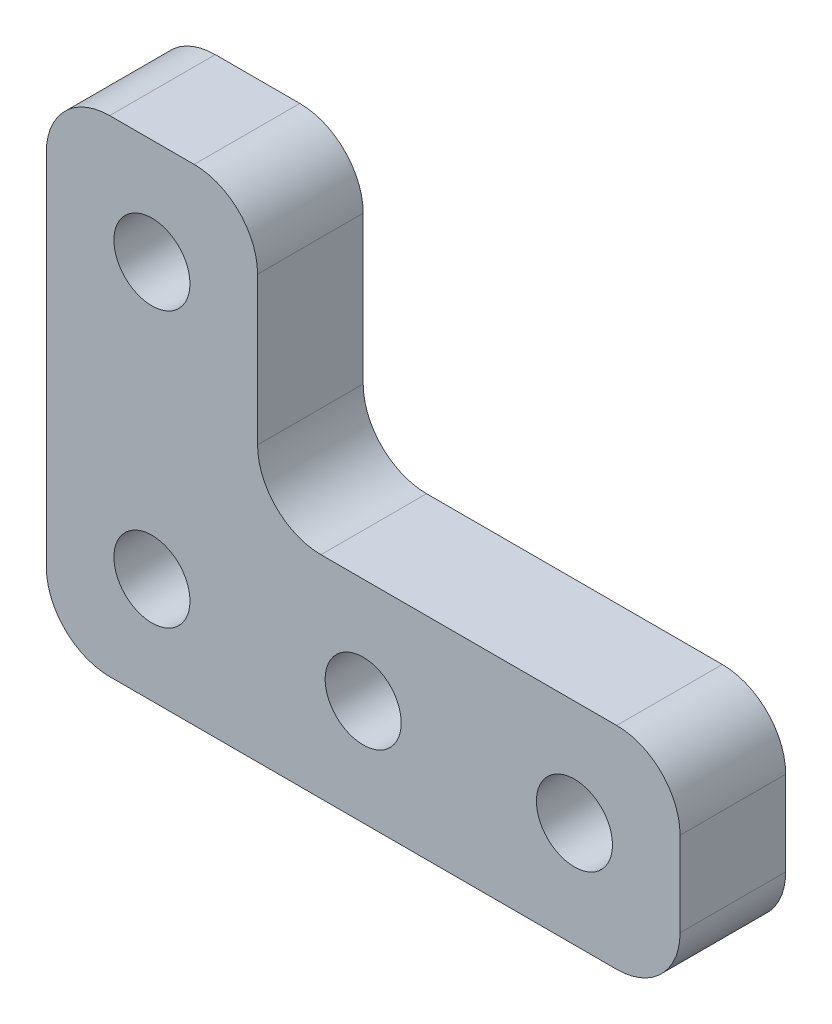
ISO-10303-21;
HEADER;
FILE_DESCRIPTION(('STEP AP214'),'2;1');
FILE_NAME('part.step','',(''),(''),'','','');
FILE_SCHEMA(('AUTOMOTIVE_DESIGN { 1 0 10303 214 1 1 1 1 }'));
ENDSEC;
DATA;
#1=APPLICATION_CONTEXT('core data for automotive mechanical design processes');
#2=APPLICATION_PROTOCOL_DEFINITION('international standard','automotive_design',2000,#1);
#3=PRODUCT_CONTEXT('',#1,'mechanical');
#4=PRODUCT('Part','Part','',(#3));
#5=PRODUCT_RELATED_PRODUCT_CATEGORY('part','',(#4));
#6=PRODUCT_DEFINITION_FORMATION('','',#4);
#7=PRODUCT_DEFINITION_CONTEXT('part definition',#1,'design');
#8=PRODUCT_DEFINITION('design','',#6,#7);
#9=PRODUCT_DEFINITION_SHAPE('','',#8);
#10=(LENGTH_UNIT() NAMED_UNIT(*) SI_UNIT(.MILLI.,.METRE.));
#11=(NAMED_UNIT(*) PLANE_ANGLE_UNIT() SI_UNIT($,.RADIAN.));
#12=(NAMED_UNIT(*) SI_UNIT($,.STERADIAN.) SOLID_ANGLE_UNIT());
#13=UNCERTAINTY_MEASURE_WITH_UNIT(LENGTH_MEASURE(1.E-05),#10,'distance_accuracy_value','');
#14=(GEOMETRIC_REPRESENTATION_CONTEXT(3) GLOBAL_UNCERTAINTY_ASSIGNED_CONTEXT((#13)) GLOBAL_UNIT_ASSIGNED_CONTEXT((#10,
#11,#12)) REPRESENTATION_CONTEXT('',''));
#15=CARTESIAN_POINT('',(0.,0.,0.));
#16=DIRECTION('',(0.,0.,1.));
#17=DIRECTION('',(1.,0.,0.));
#18=AXIS2_PLACEMENT_3D('',#15,#16,#17);
#19=CARTESIAN_POINT('',(0.,0.,6.35));
#20=DIRECTION('',(0.,0.,-1.));
#21=DIRECTION('',(-1.,0.,0.));
#22=AXIS2_PLACEMENT_3D('',#19,#20,#21);
#23=PLANE('',#22);
#24=DIRECTION('',(0.,1.,0.));
#25=VECTOR('',#24,1.);
#26=CARTESIAN_POINT('',(31.75,6.35,6.35));
#27=LINE('',#26,#25);
#28=CARTESIAN_POINT('',(31.75,-2.54,6.35));
#29=VERTEX_POINT('',#28);
#30=CARTESIAN_POINT('',(31.75,2.54,6.35));
#31=VERTEX_POINT('',#30);
#32=EDGE_CURVE('E265',#29,#31,#27,.T.);
#33=ORIENTED_EDGE('',*,*,#32,.T.);
#34=CARTESIAN_POINT('',(27.94,2.54,6.35));
#35=DIRECTION('',(0.,0.,-1.));
#36=DIRECTION('',(-1.,0.,0.));
#37=AXIS2_PLACEMENT_3D('',#34,#35,#36);
#38=CIRCLE('',#37,3.81);
#39=CARTESIAN_POINT('',(27.94,6.35,6.35));
#40=VERTEX_POINT('',#39);
#41=EDGE_CURVE('E228',#31,#40,#38,.F.);
#42=ORIENTED_EDGE('',*,*,#41,.T.);
#43=DIRECTION('',(-1.,0.,0.));
#44=VECTOR('',#43,1.);
#45=CARTESIAN_POINT('',(6.35,6.35,6.35));
#46=LINE('',#45,#44);
#47=CARTESIAN_POINT('',(10.16,6.35,6.35));
#48=VERTEX_POINT('',#47);
#49=EDGE_CURVE('E172',#40,#48,#46,.T.);
#50=ORIENTED_EDGE('',*,*,#49,.T.);
#51=CARTESIAN_POINT('',(10.16,10.16,6.35));
#52=DIRECTION('',(0.,0.,-1.));
#53=DIRECTION('',(-1.,0.,0.));
#54=AXIS2_PLACEMENT_3D('',#51,#52,#53);
#55=CIRCLE('',#54,3.81);
#56=CARTESIAN_POINT('',(6.35,10.16,6.35));
#57=VERTEX_POINT('',#56);
#58=EDGE_CURVE('E11',#48,#57,#55,.T.);
#59=ORIENTED_EDGE('',*,*,#58,.T.);
#60=DIRECTION('',(0.,1.,0.));
#61=VECTOR('',#60,1.);
#62=CARTESIAN_POINT('',(6.35,22.86,6.35));
#63=LINE('',#62,#61);
#64=CARTESIAN_POINT('',(6.35,19.05,6.35));
#65=VERTEX_POINT('',#64);
#66=EDGE_CURVE('E260',#57,#65,#63,.T.);
#67=ORIENTED_EDGE('',*,*,#66,.T.);
#68=CARTESIAN_POINT('',(2.54,19.05,6.35));
#69=DIRECTION('',(0.,0.,-1.));
#70=DIRECTION('',(-1.,0.,0.));
#71=AXIS2_PLACEMENT_3D('',#68,#69,#70);
#72=CIRCLE('',#71,3.81);
#73=CARTESIAN_POINT('',(2.54,22.86,6.35));
#74=VERTEX_POINT('',#73);
#75=EDGE_CURVE('E219',#65,#74,#72,.F.);
#76=ORIENTED_EDGE('',*,*,#75,.T.);
#77=DIRECTION('',(-1.,0.,0.));
#78=VECTOR('',#77,1.);
#79=CARTESIAN_POINT('',(-6.35,22.86,6.35));
#80=LINE('',#79,#78);
#81=CARTESIAN_POINT('',(-2.54,22.86,6.35));
#82=VERTEX_POINT('',#81);
#83=EDGE_CURVE('E262',#74,#82,#80,.T.);
#84=ORIENTED_EDGE('',*,*,#83,.T.);
#85=CARTESIAN_POINT('',(-2.54,19.05,6.35));
#86=DIRECTION('',(0.,0.,-1.));
#87=DIRECTION('',(-1.,0.,0.));
#88=AXIS2_PLACEMENT_3D('',#85,#86,#87);
#89=CIRCLE('',#88,3.81);
#90=CARTESIAN_POINT('',(-6.35,19.05,6.35));
#91=VERTEX_POINT('',#90);
#92=EDGE_CURVE('E66',#82,#91,#89,.F.);
#93=ORIENTED_EDGE('',*,*,#92,.T.);
#94=DIRECTION('',(0.,-1.,0.));
#95=VECTOR('',#94,1.);
#96=CARTESIAN_POINT('',(-6.35,-6.35,6.35));
#97=LINE('',#96,#95);
#98=CARTESIAN_POINT('',(-6.35,-2.54,6.35));
#99=VERTEX_POINT('',#98);
#100=EDGE_CURVE('E203',#91,#99,#97,.T.);
#101=ORIENTED_EDGE('',*,*,#100,.T.);
#102=CARTESIAN_POINT('',(-2.54,-2.54,6.35));
#103=DIRECTION('',(0.,0.,-1.));
#104=DIRECTION('',(-1.,0.,0.));
#105=AXIS2_PLACEMENT_3D('',#102,#103,#104);
#106=CIRCLE('',#105,3.81);
#107=CARTESIAN_POINT('',(-2.53999999999999,-6.35,6.35));
#108=VERTEX_POINT('',#107);
#109=EDGE_CURVE('E223',#99,#108,#106,.F.);
#110=ORIENTED_EDGE('',*,*,#109,.T.);
#111=DIRECTION('',(1.,0.,0.));
#112=VECTOR('',#111,1.);
#113=CARTESIAN_POINT('',(31.75,-6.35,6.35));
#114=LINE('',#113,#112);
#115=CARTESIAN_POINT('',(27.94,-6.35,6.35));
#116=VERTEX_POINT('',#115);
#117=EDGE_CURVE('E201',#108,#116,#114,.T.);
#118=ORIENTED_EDGE('',*,*,#117,.T.);
#119=CARTESIAN_POINT('',(27.94,-2.54,6.35));
#120=DIRECTION('',(0.,0.,-1.));
#121=DIRECTION('',(-1.,0.,0.));
#122=AXIS2_PLACEMENT_3D('',#119,#120,#121);
#123=CIRCLE('',#122,3.81);
#124=EDGE_CURVE('E225',#116,#29,#123,.F.);
#125=ORIENTED_EDGE('',*,*,#124,.T.);
#126=EDGE_LOOP('',(#33,#42,#50,#59,#67,#76,#84,#93,#101,#110,#118,#125));
#127=FACE_BOUND('',#126,.T.);
#128=CARTESIAN_POINT('',(0.,0.,6.35));
#129=DIRECTION('',(0.,0.,1.));
#130=DIRECTION('',(1.,0.,0.));
#131=AXIS2_PLACEMENT_3D('',#128,#129,#130);
#132=CIRCLE('',#131,2.286);
#133=CARTESIAN_POINT('',(2.286,0.,6.35));
#134=VERTEX_POINT('',#133);
#135=EDGE_CURVE('E259',#134,#134,#132,.T.);
#136=ORIENTED_EDGE('',*,*,#135,.F.);
#137=EDGE_LOOP('',(#136));
#138=FACE_BOUND('',#137,.T.);
#139=CARTESIAN_POINT('',(12.7,0.,6.35));
#140=DIRECTION('',(0.,0.,1.));
#141=DIRECTION('',(1.,0.,0.));
#142=AXIS2_PLACEMENT_3D('',#139,#140,#141);
#143=CIRCLE('',#142,2.286);
#144=CARTESIAN_POINT('',(14.986,0.,6.35));
#145=VERTEX_POINT('',#144);
#146=EDGE_CURVE('E274',#145,#145,#143,.T.);
#147=ORIENTED_EDGE('',*,*,#146,.F.);
#148=EDGE_LOOP('',(#147));
#149=FACE_BOUND('',#148,.T.);
#150=CARTESIAN_POINT('',(25.4,0.,6.35));
#151=DIRECTION('',(0.,0.,1.));
#152=DIRECTION('',(1.,0.,0.));
#153=AXIS2_PLACEMENT_3D('',#150,#151,#152);
#154=CIRCLE('',#153,2.286);
#155=CARTESIAN_POINT('',(27.686,0.,6.35));
#156=VERTEX_POINT('',#155);
#157=EDGE_CURVE('E299',#156,#156,#154,.T.);
#158=ORIENTED_EDGE('',*,*,#157,.F.);
#159=EDGE_LOOP('',(#158));
#160=FACE_BOUND('',#159,.T.);
#161=CARTESIAN_POINT('',(0.,16.51,6.35));
#162=DIRECTION('',(0.,0.,1.));
#163=DIRECTION('',(1.,0.,0.));
#164=AXIS2_PLACEMENT_3D('',#161,#162,#163);
#165=CIRCLE('',#164,2.286);
#166=CARTESIAN_POINT('',(2.286,16.51,6.35));
#167=VERTEX_POINT('',#166);
#168=EDGE_CURVE('E279',#167,#167,#165,.T.);
#169=ORIENTED_EDGE('',*,*,#168,.F.);
#170=EDGE_LOOP('',(#169));
#171=FACE_BOUND('',#170,.T.);
#172=ADVANCED_FACE('F43',(#127,#138,#149,#160,#171),#23,.F.);
#173=CARTESIAN_POINT('',(0.,0.,0.));
#174=DIRECTION('',(0.,0.,-1.));
#175=DIRECTION('',(-1.,0.,0.));
#176=AXIS2_PLACEMENT_3D('',#173,#174,#175);
#177=PLANE('',#176);
#178=CARTESIAN_POINT('',(25.4,0.,0.));
#179=DIRECTION('',(0.,0.,1.));
#180=DIRECTION('',(1.,0.,0.));
#181=AXIS2_PLACEMENT_3D('',#178,#179,#180);
#182=CIRCLE('',#181,2.286);
#183=CARTESIAN_POINT('',(27.686,0.,0.));
#184=VERTEX_POINT('',#183);
#185=EDGE_CURVE('E281',#184,#184,#182,.T.);
#186=ORIENTED_EDGE('',*,*,#185,.T.);
#187=EDGE_LOOP('',(#186));
#188=FACE_BOUND('',#187,.T.);
#189=CARTESIAN_POINT('',(0.,0.,0.));
#190=DIRECTION('',(0.,0.,1.));
#191=DIRECTION('',(1.,0.,0.));
#192=AXIS2_PLACEMENT_3D('',#189,#190,#191);
#193=CIRCLE('',#192,2.286);
#194=CARTESIAN_POINT('',(2.286,0.,0.));
#195=VERTEX_POINT('',#194);
#196=EDGE_CURVE('E270',#195,#195,#193,.T.);
#197=ORIENTED_EDGE('',*,*,#196,.T.);
#198=EDGE_LOOP('',(#197));
#199=FACE_BOUND('',#198,.T.);
#200=DIRECTION('',(-1.,0.,0.));
#201=VECTOR('',#200,1.);
#202=CARTESIAN_POINT('',(6.35,6.35,0.));
#203=LINE('',#202,#201);
#204=CARTESIAN_POINT('',(27.94,6.35,0.));
#205=VERTEX_POINT('',#204);
#206=CARTESIAN_POINT('',(10.16,6.35,0.));
#207=VERTEX_POINT('',#206);
#208=EDGE_CURVE('E169',#205,#207,#203,.T.);
#209=ORIENTED_EDGE('',*,*,#208,.F.);
#210=CARTESIAN_POINT('',(27.94,2.54,0.));
#211=DIRECTION('',(0.,0.,-1.));
#212=DIRECTION('',(-1.,0.,0.));
#213=AXIS2_PLACEMENT_3D('',#210,#211,#212);
#214=CIRCLE('',#213,3.81);
#215=CARTESIAN_POINT('',(31.75,2.54,0.));
#216=VERTEX_POINT('',#215);
#217=EDGE_CURVE('E151',#205,#216,#214,.T.);
#218=ORIENTED_EDGE('',*,*,#217,.T.);
#219=DIRECTION('',(0.,1.,0.));
#220=VECTOR('',#219,1.);
#221=CARTESIAN_POINT('',(31.75,6.35,0.));
#222=LINE('',#221,#220);
#223=CARTESIAN_POINT('',(31.75,-2.54,0.));
#224=VERTEX_POINT('',#223);
#225=EDGE_CURVE('E182',#224,#216,#222,.T.);
#226=ORIENTED_EDGE('',*,*,#225,.F.);
#227=CARTESIAN_POINT('',(27.94,-2.54,0.));
#228=DIRECTION('',(0.,0.,-1.));
#229=DIRECTION('',(-1.,0.,0.));
#230=AXIS2_PLACEMENT_3D('',#227,#228,#229);
#231=CIRCLE('',#230,3.81);
#232=CARTESIAN_POINT('',(27.94,-6.35,0.));
#233=VERTEX_POINT('',#232);
#234=EDGE_CURVE('E163',#224,#233,#231,.T.);
#235=ORIENTED_EDGE('',*,*,#234,.T.);
#236=DIRECTION('',(1.,0.,0.));
#237=VECTOR('',#236,1.);
#238=CARTESIAN_POINT('',(31.75,-6.35,0.));
#239=LINE('',#238,#237);
#240=CARTESIAN_POINT('',(-2.53999999999999,-6.35,0.));
#241=VERTEX_POINT('',#240);
#242=EDGE_CURVE('E191',#241,#233,#239,.T.);
#243=ORIENTED_EDGE('',*,*,#242,.F.);
#244=CARTESIAN_POINT('',(-2.54,-2.54,0.));
#245=DIRECTION('',(0.,0.,-1.));
#246=DIRECTION('',(-1.,0.,0.));
#247=AXIS2_PLACEMENT_3D('',#244,#245,#246);
#248=CIRCLE('',#247,3.81);
#249=CARTESIAN_POINT('',(-6.35,-2.54,0.));
#250=VERTEX_POINT('',#249);
#251=EDGE_CURVE('E209',#241,#250,#248,.T.);
#252=ORIENTED_EDGE('',*,*,#251,.T.);
#253=DIRECTION('',(0.,-1.,0.));
#254=VECTOR('',#253,1.);
#255=CARTESIAN_POINT('',(-6.35,-6.35,0.));
#256=LINE('',#255,#254);
#257=CARTESIAN_POINT('',(-6.35,19.05,0.));
#258=VERTEX_POINT('',#257);
#259=EDGE_CURVE('E198',#258,#250,#256,.T.);
#260=ORIENTED_EDGE('',*,*,#259,.F.);
#261=CARTESIAN_POINT('',(-2.54,19.05,0.));
#262=DIRECTION('',(0.,0.,-1.));
#263=DIRECTION('',(-1.,0.,0.));
#264=AXIS2_PLACEMENT_3D('',#261,#262,#263);
#265=CIRCLE('',#264,3.81);
#266=CARTESIAN_POINT('',(-2.54,22.86,0.));
#267=VERTEX_POINT('',#266);
#268=EDGE_CURVE('E207',#258,#267,#265,.T.);
#269=ORIENTED_EDGE('',*,*,#268,.T.);
#270=DIRECTION('',(-1.,0.,0.));
#271=VECTOR('',#270,1.);
#272=CARTESIAN_POINT('',(-6.35,22.86,0.));
#273=LINE('',#272,#271);
#274=CARTESIAN_POINT('',(2.54,22.86,0.));
#275=VERTEX_POINT('',#274);
#276=EDGE_CURVE('E188',#275,#267,#273,.T.);
#277=ORIENTED_EDGE('',*,*,#276,.F.);
#278=CARTESIAN_POINT('',(2.54,19.05,0.));
#279=DIRECTION('',(0.,0.,-1.));
#280=DIRECTION('',(-1.,0.,0.));
#281=AXIS2_PLACEMENT_3D('',#278,#279,#280);
#282=CIRCLE('',#281,3.81);
#283=CARTESIAN_POINT('',(6.35,19.05,0.));
#284=VERTEX_POINT('',#283);
#285=EDGE_CURVE('E174',#275,#284,#282,.T.);
#286=ORIENTED_EDGE('',*,*,#285,.T.);
#287=DIRECTION('',(0.,1.,0.));
#288=VECTOR('',#287,1.);
#289=CARTESIAN_POINT('',(6.35,22.86,0.));
#290=LINE('',#289,#288);
#291=CARTESIAN_POINT('',(6.35,10.16,0.));
#292=VERTEX_POINT('',#291);
#293=EDGE_CURVE('E181',#292,#284,#290,.T.);
#294=ORIENTED_EDGE('',*,*,#293,.F.);
#295=CARTESIAN_POINT('',(10.16,10.16,0.));
#296=DIRECTION('',(0.,0.,-1.));
#297=DIRECTION('',(-1.,0.,0.));
#298=AXIS2_PLACEMENT_3D('',#295,#296,#297);
#299=CIRCLE('',#298,3.81);
#300=EDGE_CURVE('E52',#292,#207,#299,.F.);
#301=ORIENTED_EDGE('',*,*,#300,.T.);
#302=EDGE_LOOP('',(#209,#218,#226,#235,#243,#252,#260,#269,#277,#286,#294,#301));
#303=FACE_BOUND('',#302,.T.);
#304=CARTESIAN_POINT('',(12.7,0.,0.));
#305=DIRECTION('',(0.,0.,1.));
#306=DIRECTION('',(1.,0.,0.));
#307=AXIS2_PLACEMENT_3D('',#304,#305,#306);
#308=CIRCLE('',#307,2.286);
#309=CARTESIAN_POINT('',(14.986,0.,0.));
#310=VERTEX_POINT('',#309);
#311=EDGE_CURVE('E295',#310,#310,#308,.T.);
#312=ORIENTED_EDGE('',*,*,#311,.T.);
#313=EDGE_LOOP('',(#312));
#314=FACE_BOUND('',#313,.T.);
#315=CARTESIAN_POINT('',(0.,16.51,0.));
#316=DIRECTION('',(0.,0.,1.));
#317=DIRECTION('',(1.,0.,0.));
#318=AXIS2_PLACEMENT_3D('',#315,#316,#317);
#319=CIRCLE('',#318,2.286);
#320=CARTESIAN_POINT('',(2.286,16.51,0.));
#321=VERTEX_POINT('',#320);
#322=EDGE_CURVE('E282',#321,#321,#319,.T.);
#323=ORIENTED_EDGE('',*,*,#322,.T.);
#324=EDGE_LOOP('',(#323));
#325=FACE_BOUND('',#324,.T.);
#326=ADVANCED_FACE('F177',(#188,#199,#303,#314,#325),#177,.T.);
#327=CARTESIAN_POINT('',(31.75,-6.35,6.35));
#328=DIRECTION('',(0.,1.,0.));
#329=DIRECTION('',(-1.,0.,0.));
#330=AXIS2_PLACEMENT_3D('',#327,#328,#329);
#331=PLANE('',#330);
#332=ORIENTED_EDGE('',*,*,#242,.T.);
#333=DIRECTION('',(0.,0.,-1.));
#334=VECTOR('',#333,1.);
#335=CARTESIAN_POINT('',(27.94,-6.35,6.35));
#336=LINE('',#335,#334);
#337=EDGE_CURVE('E234',#233,#116,#336,.F.);
#338=ORIENTED_EDGE('',*,*,#337,.T.);
#339=ORIENTED_EDGE('',*,*,#117,.F.);
#340=DIRECTION('',(0.,0.,-1.));
#341=VECTOR('',#340,1.);
#342=CARTESIAN_POINT('',(-2.54,-6.35,6.35));
#343=LINE('',#342,#341);
#344=EDGE_CURVE('E231',#108,#241,#343,.T.);
#345=ORIENTED_EDGE('',*,*,#344,.T.);
#346=EDGE_LOOP('',(#332,#338,#339,#345));
#347=FACE_BOUND('',#346,.T.);
#348=ADVANCED_FACE('F323',(#347),#331,.F.);
#349=CARTESIAN_POINT('',(31.75,6.35,6.35));
#350=DIRECTION('',(-1.,0.,0.));
#351=DIRECTION('',(0.,0.,1.));
#352=AXIS2_PLACEMENT_3D('',#349,#350,#351);
#353=PLANE('',#352);
#354=ORIENTED_EDGE('',*,*,#225,.T.);
#355=DIRECTION('',(0.,0.,-1.));
#356=VECTOR('',#355,1.);
#357=CARTESIAN_POINT('',(31.75,2.54,6.35));
#358=LINE('',#357,#356);
#359=EDGE_CURVE('E156',#216,#31,#358,.F.);
#360=ORIENTED_EDGE('',*,*,#359,.T.);
#361=ORIENTED_EDGE('',*,*,#32,.F.);
#362=DIRECTION('',(0.,0.,-1.));
#363=VECTOR('',#362,1.);
#364=CARTESIAN_POINT('',(31.75,-2.54,6.35));
#365=LINE('',#364,#363);
#366=EDGE_CURVE('E162',#29,#224,#365,.T.);
#367=ORIENTED_EDGE('',*,*,#366,.T.);
#368=EDGE_LOOP('',(#354,#360,#361,#367));
#369=FACE_BOUND('',#368,.T.);
#370=ADVANCED_FACE('F329',(#369),#353,.F.);
#371=CARTESIAN_POINT('',(6.35,6.35,6.35));
#372=DIRECTION('',(0.,-1.,0.));
#373=DIRECTION('',(1.,0.,0.));
#374=AXIS2_PLACEMENT_3D('',#371,#372,#373);
#375=PLANE('',#374);
#376=ORIENTED_EDGE('',*,*,#49,.F.);
#377=DIRECTION('',(0.,0.,-1.));
#378=VECTOR('',#377,1.);
#379=CARTESIAN_POINT('',(27.94,6.35,6.35));
#380=LINE('',#379,#378);
#381=EDGE_CURVE('E155',#40,#205,#380,.T.);
#382=ORIENTED_EDGE('',*,*,#381,.T.);
#383=ORIENTED_EDGE('',*,*,#208,.T.);
#384=DIRECTION('',(0.,0.,-1.));
#385=VECTOR('',#384,1.);
#386=CARTESIAN_POINT('',(10.16,6.35,6.35));
#387=LINE('',#386,#385);
#388=EDGE_CURVE('E175',#207,#48,#387,.F.);
#389=ORIENTED_EDGE('',*,*,#388,.T.);
#390=EDGE_LOOP('',(#376,#382,#383,#389));
#391=FACE_BOUND('',#390,.T.);
#392=ADVANCED_FACE('F168',(#391),#375,.F.);
#393=CARTESIAN_POINT('',(6.35,22.86,6.35));
#394=DIRECTION('',(-1.,0.,0.));
#395=DIRECTION('',(0.,-1.,0.));
#396=AXIS2_PLACEMENT_3D('',#393,#394,#395);
#397=PLANE('',#396);
#398=ORIENTED_EDGE('',*,*,#293,.T.);
#399=DIRECTION('',(0.,0.,-1.));
#400=VECTOR('',#399,1.);
#401=CARTESIAN_POINT('',(6.35,19.05,6.35));
#402=LINE('',#401,#400);
#403=EDGE_CURVE('E252',#284,#65,#402,.F.);
#404=ORIENTED_EDGE('',*,*,#403,.T.);
#405=ORIENTED_EDGE('',*,*,#66,.F.);
#406=DIRECTION('',(0.,0.,-1.));
#407=VECTOR('',#406,1.);
#408=CARTESIAN_POINT('',(6.35,10.16,0.));
#409=LINE('',#408,#407);
#410=EDGE_CURVE('E248',#57,#292,#409,.T.);
#411=ORIENTED_EDGE('',*,*,#410,.T.);
#412=EDGE_LOOP('',(#398,#404,#405,#411));
#413=FACE_BOUND('',#412,.T.);
#414=ADVANCED_FACE('F342',(#413),#397,.F.);
#415=CARTESIAN_POINT('',(-6.35,22.86,6.35));
#416=DIRECTION('',(0.,-1.,0.));
#417=DIRECTION('',(0.,0.,-1.));
#418=AXIS2_PLACEMENT_3D('',#415,#416,#417);
#419=PLANE('',#418);
#420=ORIENTED_EDGE('',*,*,#276,.T.);
#421=DIRECTION('',(0.,0.,-1.));
#422=VECTOR('',#421,1.);
#423=CARTESIAN_POINT('',(-2.54,22.86,6.35));
#424=LINE('',#423,#422);
#425=EDGE_CURVE('E246',#267,#82,#424,.F.);
#426=ORIENTED_EDGE('',*,*,#425,.T.);
#427=ORIENTED_EDGE('',*,*,#83,.F.);
#428=DIRECTION('',(0.,0.,-1.));
#429=VECTOR('',#428,1.);
#430=CARTESIAN_POINT('',(2.54,22.86,6.35));
#431=LINE('',#430,#429);
#432=EDGE_CURVE('E242',#74,#275,#431,.T.);
#433=ORIENTED_EDGE('',*,*,#432,.T.);
#434=EDGE_LOOP('',(#420,#426,#427,#433));
#435=FACE_BOUND('',#434,.T.);
#436=ADVANCED_FACE('F339',(#435),#419,.F.);
#437=CARTESIAN_POINT('',(-6.35,-6.35,6.35));
#438=DIRECTION('',(1.,0.,0.));
#439=DIRECTION('',(0.,1.,0.));
#440=AXIS2_PLACEMENT_3D('',#437,#438,#439);
#441=PLANE('',#440);
#442=ORIENTED_EDGE('',*,*,#259,.T.);
#443=DIRECTION('',(0.,0.,-1.));
#444=VECTOR('',#443,1.);
#445=CARTESIAN_POINT('',(-6.35,-2.54,6.35));
#446=LINE('',#445,#444);
#447=EDGE_CURVE('E59',#250,#99,#446,.F.);
#448=ORIENTED_EDGE('',*,*,#447,.T.);
#449=ORIENTED_EDGE('',*,*,#100,.F.);
#450=DIRECTION('',(0.,0.,-1.));
#451=VECTOR('',#450,1.);
#452=CARTESIAN_POINT('',(-6.35,19.05,6.35));
#453=LINE('',#452,#451);
#454=EDGE_CURVE('E237',#91,#258,#453,.T.);
#455=ORIENTED_EDGE('',*,*,#454,.T.);
#456=EDGE_LOOP('',(#442,#448,#449,#455));
#457=FACE_BOUND('',#456,.T.);
#458=ADVANCED_FACE('F335',(#457),#441,.F.);
#459=CARTESIAN_POINT('',(0.,0.,6.35));
#460=DIRECTION('',(0.,0.,-1.));
#461=DIRECTION('',(-1.,0.,0.));
#462=AXIS2_PLACEMENT_3D('',#459,#460,#461);
#463=CYLINDRICAL_SURFACE('',#462,2.286);
#464=ORIENTED_EDGE('',*,*,#135,.T.);
#465=EDGE_LOOP('',(#464));
#466=FACE_BOUND('',#465,.T.);
#467=ORIENTED_EDGE('',*,*,#196,.F.);
#468=EDGE_LOOP('',(#467));
#469=FACE_BOUND('',#468,.T.);
#470=ADVANCED_FACE('F338',(#466,#469),#463,.F.);
#471=CARTESIAN_POINT('',(12.7,0.,6.35));
#472=DIRECTION('',(0.,0.,-1.));
#473=DIRECTION('',(-1.,0.,0.));
#474=AXIS2_PLACEMENT_3D('',#471,#472,#473);
#475=CYLINDRICAL_SURFACE('',#474,2.286);
#476=ORIENTED_EDGE('',*,*,#146,.T.);
#477=EDGE_LOOP('',(#476));
#478=FACE_BOUND('',#477,.T.);
#479=ORIENTED_EDGE('',*,*,#311,.F.);
#480=EDGE_LOOP('',(#479));
#481=FACE_BOUND('',#480,.T.);
#482=ADVANCED_FACE('F395',(#478,#481),#475,.F.);
#483=CARTESIAN_POINT('',(25.4,0.,6.35));
#484=DIRECTION('',(0.,0.,-1.));
#485=DIRECTION('',(-1.,0.,0.));
#486=AXIS2_PLACEMENT_3D('',#483,#484,#485);
#487=CYLINDRICAL_SURFACE('',#486,2.286);
#488=ORIENTED_EDGE('',*,*,#157,.T.);
#489=EDGE_LOOP('',(#488));
#490=FACE_BOUND('',#489,.T.);
#491=ORIENTED_EDGE('',*,*,#185,.F.);
#492=EDGE_LOOP('',(#491));
#493=FACE_BOUND('',#492,.T.);
#494=ADVANCED_FACE('F308',(#490,#493),#487,.F.);
#495=CARTESIAN_POINT('',(0.,16.51,6.35));
#496=DIRECTION('',(0.,0.,-1.));
#497=DIRECTION('',(-1.,0.,0.));
#498=AXIS2_PLACEMENT_3D('',#495,#496,#497);
#499=CYLINDRICAL_SURFACE('',#498,2.286);
#500=ORIENTED_EDGE('',*,*,#168,.T.);
#501=EDGE_LOOP('',(#500));
#502=FACE_BOUND('',#501,.T.);
#503=ORIENTED_EDGE('',*,*,#322,.F.);
#504=EDGE_LOOP('',(#503));
#505=FACE_BOUND('',#504,.T.);
#506=ADVANCED_FACE('F316',(#502,#505),#499,.F.);
#507=CARTESIAN_POINT('',(27.94,2.54,6.35));
#508=DIRECTION('',(0.,0.,-1.));
#509=DIRECTION('',(-1.,0.,0.));
#510=AXIS2_PLACEMENT_3D('',#507,#508,#509);
#511=CYLINDRICAL_SURFACE('',#510,3.81);
#512=ORIENTED_EDGE('',*,*,#41,.F.);
#513=ORIENTED_EDGE('',*,*,#359,.F.);
#514=ORIENTED_EDGE('',*,*,#217,.F.);
#515=ORIENTED_EDGE('',*,*,#381,.F.);
#516=EDGE_LOOP('',(#512,#513,#514,#515));
#517=FACE_BOUND('',#516,.T.);
#518=ADVANCED_FACE('F154',(#517),#511,.T.);
#519=CARTESIAN_POINT('',(27.94,-2.54,6.35));
#520=DIRECTION('',(0.,0.,-1.));
#521=DIRECTION('',(-1.,0.,0.));
#522=AXIS2_PLACEMENT_3D('',#519,#520,#521);
#523=CYLINDRICAL_SURFACE('',#522,3.81);
#524=ORIENTED_EDGE('',*,*,#124,.F.);
#525=ORIENTED_EDGE('',*,*,#337,.F.);
#526=ORIENTED_EDGE('',*,*,#234,.F.);
#527=ORIENTED_EDGE('',*,*,#366,.F.);
#528=EDGE_LOOP('',(#524,#525,#526,#527));
#529=FACE_BOUND('',#528,.T.);
#530=ADVANCED_FACE('F354',(#529),#523,.T.);
#531=CARTESIAN_POINT('',(-2.54,-2.54,6.35));
#532=DIRECTION('',(0.,0.,-1.));
#533=DIRECTION('',(-1.,0.,0.));
#534=AXIS2_PLACEMENT_3D('',#531,#532,#533);
#535=CYLINDRICAL_SURFACE('',#534,3.81);
#536=ORIENTED_EDGE('',*,*,#109,.F.);
#537=ORIENTED_EDGE('',*,*,#447,.F.);
#538=ORIENTED_EDGE('',*,*,#251,.F.);
#539=ORIENTED_EDGE('',*,*,#344,.F.);
#540=EDGE_LOOP('',(#536,#537,#538,#539));
#541=FACE_BOUND('',#540,.T.);
#542=ADVANCED_FACE('F357',(#541),#535,.T.);
#543=CARTESIAN_POINT('',(-2.54,19.05,6.35));
#544=DIRECTION('',(0.,0.,-1.));
#545=DIRECTION('',(-1.,0.,0.));
#546=AXIS2_PLACEMENT_3D('',#543,#544,#545);
#547=CYLINDRICAL_SURFACE('',#546,3.81);
#548=ORIENTED_EDGE('',*,*,#92,.F.);
#549=ORIENTED_EDGE('',*,*,#425,.F.);
#550=ORIENTED_EDGE('',*,*,#268,.F.);
#551=ORIENTED_EDGE('',*,*,#454,.F.);
#552=EDGE_LOOP('',(#548,#549,#550,#551));
#553=FACE_BOUND('',#552,.T.);
#554=ADVANCED_FACE('F361',(#553),#547,.T.);
#555=CARTESIAN_POINT('',(2.54,19.05,6.35));
#556=DIRECTION('',(0.,0.,-1.));
#557=DIRECTION('',(-1.,0.,0.));
#558=AXIS2_PLACEMENT_3D('',#555,#556,#557);
#559=CYLINDRICAL_SURFACE('',#558,3.81);
#560=ORIENTED_EDGE('',*,*,#75,.F.);
#561=ORIENTED_EDGE('',*,*,#403,.F.);
#562=ORIENTED_EDGE('',*,*,#285,.F.);
#563=ORIENTED_EDGE('',*,*,#432,.F.);
#564=EDGE_LOOP('',(#560,#561,#562,#563));
#565=FACE_BOUND('',#564,.T.);
#566=ADVANCED_FACE('F364',(#565),#559,.T.);
#567=CARTESIAN_POINT('',(10.16,10.16,6.35));
#568=DIRECTION('',(0.,0.,1.));
#569=DIRECTION('',(1.,0.,0.));
#570=AXIS2_PLACEMENT_3D('',#567,#568,#569);
#571=CYLINDRICAL_SURFACE('',#570,3.81);
#572=ORIENTED_EDGE('',*,*,#58,.F.);
#573=ORIENTED_EDGE('',*,*,#388,.F.);
#574=ORIENTED_EDGE('',*,*,#300,.F.);
#575=ORIENTED_EDGE('',*,*,#410,.F.);
#576=EDGE_LOOP('',(#572,#573,#574,#575));
#577=FACE_BOUND('',#576,.T.);
#578=ADVANCED_FACE('F45',(#577),#571,.F.);
#579=CLOSED_SHELL('',(#172,#326,#348,#370,#392,#414,#436,#458,#470,#482,#494,#506,#518,#530,
#542,#554,#566,#578));
#580=MANIFOLD_SOLID_BREP('B2',#579);
#581=ADVANCED_BREP_SHAPE_REPRESENTATION('',(#18,#580),#14);
#582=SHAPE_DEFINITION_REPRESENTATION(#9,#581);
ENDSEC;
END-ISO-10303-21;
